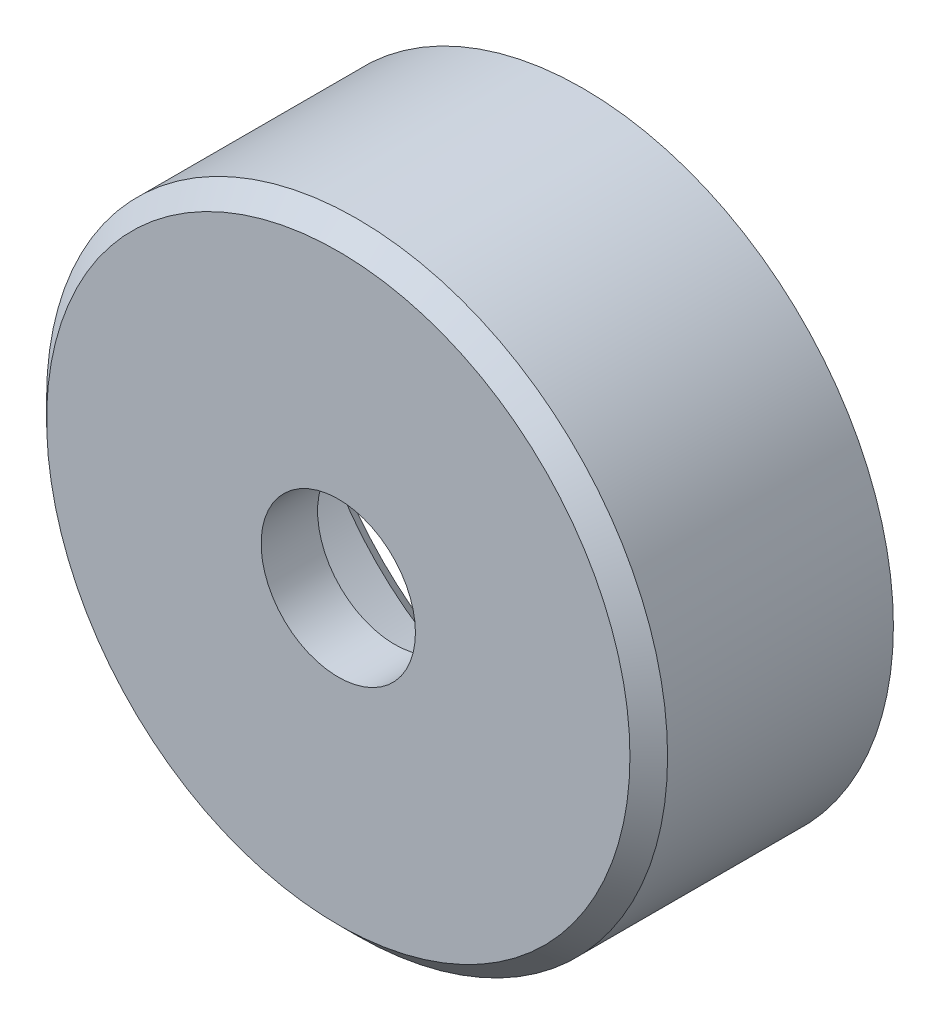
ISO-10303-21;
HEADER;
FILE_DESCRIPTION(('STEP AP214'),'2;1');
FILE_NAME('part.step','',(''),(''),'','','');
FILE_SCHEMA(('AUTOMOTIVE_DESIGN { 1 0 10303 214 1 1 1 1 }'));
ENDSEC;
DATA;
#1=APPLICATION_CONTEXT('core data for automotive mechanical design processes');
#2=APPLICATION_PROTOCOL_DEFINITION('international standard','automotive_design',2000,#1);
#3=PRODUCT_CONTEXT('',#1,'mechanical');
#4=PRODUCT('Part','Part','',(#3));
#5=PRODUCT_RELATED_PRODUCT_CATEGORY('part','',(#4));
#6=PRODUCT_DEFINITION_FORMATION('','',#4);
#7=PRODUCT_DEFINITION_CONTEXT('part definition',#1,'design');
#8=PRODUCT_DEFINITION('design','',#6,#7);
#9=PRODUCT_DEFINITION_SHAPE('','',#8);
#10=(LENGTH_UNIT() NAMED_UNIT(*) SI_UNIT(.MILLI.,.METRE.));
#11=(NAMED_UNIT(*) PLANE_ANGLE_UNIT() SI_UNIT($,.RADIAN.));
#12=(NAMED_UNIT(*) SI_UNIT($,.STERADIAN.) SOLID_ANGLE_UNIT());
#13=UNCERTAINTY_MEASURE_WITH_UNIT(LENGTH_MEASURE(1.E-05),#10,'distance_accuracy_value','');
#14=(GEOMETRIC_REPRESENTATION_CONTEXT(3) GLOBAL_UNCERTAINTY_ASSIGNED_CONTEXT((#13)) GLOBAL_UNIT_ASSIGNED_CONTEXT((#10,
#11,#12)) REPRESENTATION_CONTEXT('',''));
#15=CARTESIAN_POINT('',(0.,0.,0.));
#16=DIRECTION('',(0.,0.,1.));
#17=DIRECTION('',(1.,0.,0.));
#18=AXIS2_PLACEMENT_3D('',#15,#16,#17);
#19=CARTESIAN_POINT('',(0.,0.,0.));
#20=DIRECTION('',(0.,0.,1.));
#21=DIRECTION('',(1.,0.,0.));
#22=AXIS2_PLACEMENT_3D('',#19,#20,#21);
#23=PLANE('',#22);
#24=CARTESIAN_POINT('',(0.,0.,0.));
#25=DIRECTION('',(0.,0.,1.));
#26=DIRECTION('',(1.,0.,0.));
#27=AXIS2_PLACEMENT_3D('',#24,#25,#26);
#28=CIRCLE('',#27,15.);
#29=CARTESIAN_POINT('',(15.,0.,0.));
#30=VERTEX_POINT('',#29);
#31=EDGE_CURVE('E46',#30,#30,#28,.T.);
#32=ORIENTED_EDGE('',*,*,#31,.T.);
#33=EDGE_LOOP('',(#32));
#34=FACE_BOUND('',#33,.T.);
#35=CARTESIAN_POINT('',(0.,0.,0.));
#36=DIRECTION('',(0.,0.,1.));
#37=DIRECTION('',(1.,0.,0.));
#38=AXIS2_PLACEMENT_3D('',#35,#36,#37);
#39=CIRCLE('',#38,16.5);
#40=CARTESIAN_POINT('',(16.5,0.,0.));
#41=VERTEX_POINT('',#40);
#42=EDGE_CURVE('E55',#41,#41,#39,.T.);
#43=ORIENTED_EDGE('',*,*,#42,.F.);
#44=EDGE_LOOP('',(#43));
#45=FACE_BOUND('',#44,.T.);
#46=ADVANCED_FACE('F31',(#34,#45),#23,.F.);
#47=CARTESIAN_POINT('',(0.,0.,10.));
#48=DIRECTION('',(0.,0.,-1.));
#49=DIRECTION('',(-1.,0.,0.));
#50=AXIS2_PLACEMENT_3D('',#47,#48,#49);
#51=CYLINDRICAL_SURFACE('',#50,16.5);
#52=CARTESIAN_POINT('',(0.,0.,12.));
#53=DIRECTION('',(0.,0.,1.));
#54=DIRECTION('',(1.,0.,0.));
#55=AXIS2_PLACEMENT_3D('',#52,#53,#54);
#56=CIRCLE('',#55,16.5);
#57=CARTESIAN_POINT('',(16.5,0.,12.));
#58=VERTEX_POINT('',#57);
#59=EDGE_CURVE('E10',#58,#58,#56,.F.);
#60=ORIENTED_EDGE('',*,*,#59,.T.);
#61=EDGE_LOOP('',(#60));
#62=FACE_BOUND('',#61,.T.);
#63=ORIENTED_EDGE('',*,*,#42,.T.);
#64=EDGE_LOOP('',(#63));
#65=FACE_BOUND('',#64,.T.);
#66=ADVANCED_FACE('F81',(#62,#65),#51,.T.);
#67=CARTESIAN_POINT('',(0.,0.,10.));
#68=DIRECTION('',(0.,0.,-1.));
#69=DIRECTION('',(-1.,0.,0.));
#70=AXIS2_PLACEMENT_3D('',#67,#68,#69);
#71=CYLINDRICAL_SURFACE('',#70,14.);
#72=CARTESIAN_POINT('',(0.,0.,1.));
#73=DIRECTION('',(0.,0.,1.));
#74=DIRECTION('',(1.,0.,0.));
#75=AXIS2_PLACEMENT_3D('',#72,#73,#74);
#76=CIRCLE('',#75,14.);
#77=CARTESIAN_POINT('',(14.,0.,1.));
#78=VERTEX_POINT('',#77);
#79=EDGE_CURVE('E42',#78,#78,#76,.F.);
#80=ORIENTED_EDGE('',*,*,#79,.T.);
#81=EDGE_LOOP('',(#80));
#82=FACE_BOUND('',#81,.T.);
#83=CARTESIAN_POINT('',(0.,0.,10.));
#84=DIRECTION('',(0.,0.,1.));
#85=DIRECTION('',(1.,0.,0.));
#86=AXIS2_PLACEMENT_3D('',#83,#84,#85);
#87=CIRCLE('',#86,14.);
#88=CARTESIAN_POINT('',(14.,0.,10.));
#89=VERTEX_POINT('',#88);
#90=EDGE_CURVE('E58',#89,#89,#87,.T.);
#91=ORIENTED_EDGE('',*,*,#90,.T.);
#92=EDGE_LOOP('',(#91));
#93=FACE_BOUND('',#92,.T.);
#94=ADVANCED_FACE('F88',(#82,#93),#71,.F.);
#95=CARTESIAN_POINT('',(0.,0.,10.));
#96=DIRECTION('',(0.,0.,1.));
#97=DIRECTION('',(1.,0.,0.));
#98=AXIS2_PLACEMENT_3D('',#95,#96,#97);
#99=PLANE('',#98);
#100=CARTESIAN_POINT('',(0.,0.,10.));
#101=DIRECTION('',(0.,0.,1.));
#102=DIRECTION('',(1.,0.,0.));
#103=AXIS2_PLACEMENT_3D('',#100,#101,#102);
#104=CIRCLE('',#103,4.1);
#105=CARTESIAN_POINT('',(4.1,0.,10.));
#106=VERTEX_POINT('',#105);
#107=EDGE_CURVE('E51',#106,#106,#104,.T.);
#108=ORIENTED_EDGE('',*,*,#107,.T.);
#109=EDGE_LOOP('',(#108));
#110=FACE_BOUND('',#109,.T.);
#111=ORIENTED_EDGE('',*,*,#90,.F.);
#112=EDGE_LOOP('',(#111));
#113=FACE_BOUND('',#112,.T.);
#114=ADVANCED_FACE('F64',(#110,#113),#99,.F.);
#115=CARTESIAN_POINT('',(0.,0.,13.));
#116=DIRECTION('',(0.,0.,1.));
#117=DIRECTION('',(1.,0.,0.));
#118=AXIS2_PLACEMENT_3D('',#115,#116,#117);
#119=PLANE('',#118);
#120=CARTESIAN_POINT('',(0.,0.,13.));
#121=DIRECTION('',(0.,0.,1.));
#122=DIRECTION('',(1.,0.,0.));
#123=AXIS2_PLACEMENT_3D('',#120,#121,#122);
#124=CIRCLE('',#123,15.5);
#125=CARTESIAN_POINT('',(15.5,0.,13.));
#126=VERTEX_POINT('',#125);
#127=EDGE_CURVE('E38',#126,#126,#124,.T.);
#128=ORIENTED_EDGE('',*,*,#127,.T.);
#129=EDGE_LOOP('',(#128));
#130=FACE_BOUND('',#129,.T.);
#131=CARTESIAN_POINT('',(0.,0.,13.));
#132=DIRECTION('',(0.,0.,1.));
#133=DIRECTION('',(1.,0.,0.));
#134=AXIS2_PLACEMENT_3D('',#131,#132,#133);
#135=CIRCLE('',#134,4.1);
#136=CARTESIAN_POINT('',(4.1,0.,13.));
#137=VERTEX_POINT('',#136);
#138=EDGE_CURVE('E49',#137,#137,#135,.T.);
#139=ORIENTED_EDGE('',*,*,#138,.F.);
#140=EDGE_LOOP('',(#139));
#141=FACE_BOUND('',#140,.T.);
#142=ADVANCED_FACE('F77',(#130,#141),#119,.T.);
#143=CARTESIAN_POINT('',(0.,0.,0.));
#144=DIRECTION('',(0.,0.,-1.));
#145=DIRECTION('',(-1.,0.,0.));
#146=AXIS2_PLACEMENT_3D('',#143,#144,#145);
#147=CONICAL_SURFACE('',#146,15.,0.785398163397445);
#148=ORIENTED_EDGE('',*,*,#79,.F.);
#149=EDGE_LOOP('',(#148));
#150=FACE_BOUND('',#149,.T.);
#151=ORIENTED_EDGE('',*,*,#31,.F.);
#152=EDGE_LOOP('',(#151));
#153=FACE_BOUND('',#152,.T.);
#154=ADVANCED_FACE('F69',(#150,#153),#147,.F.);
#155=CARTESIAN_POINT('',(0.,0.,0.));
#156=DIRECTION('',(0.,0.,1.));
#157=DIRECTION('',(1.,0.,0.));
#158=AXIS2_PLACEMENT_3D('',#155,#156,#157);
#159=CYLINDRICAL_SURFACE('',#158,4.1);
#160=ORIENTED_EDGE('',*,*,#138,.T.);
#161=EDGE_LOOP('',(#160));
#162=FACE_BOUND('',#161,.T.);
#163=ORIENTED_EDGE('',*,*,#107,.F.);
#164=EDGE_LOOP('',(#163));
#165=FACE_BOUND('',#164,.T.);
#166=ADVANCED_FACE('F67',(#162,#165),#159,.F.);
#167=CARTESIAN_POINT('',(0.,0.,13.));
#168=DIRECTION('',(0.,0.,-1.));
#169=DIRECTION('',(-1.,0.,0.));
#170=AXIS2_PLACEMENT_3D('',#167,#168,#169);
#171=CONICAL_SURFACE('',#170,15.5,0.785398163397448);
#172=ORIENTED_EDGE('',*,*,#59,.F.);
#173=EDGE_LOOP('',(#172));
#174=FACE_BOUND('',#173,.T.);
#175=ORIENTED_EDGE('',*,*,#127,.F.);
#176=EDGE_LOOP('',(#175));
#177=FACE_BOUND('',#176,.T.);
#178=ADVANCED_FACE('F33',(#174,#177),#171,.T.);
#179=CLOSED_SHELL('',(#46,#66,#94,#114,#142,#154,#166,#178));
#180=MANIFOLD_SOLID_BREP('B2',#179);
#181=ADVANCED_BREP_SHAPE_REPRESENTATION('',(#18,#180),#14);
#182=SHAPE_DEFINITION_REPRESENTATION(#9,#181);
ENDSEC;
END-ISO-10303-21;
